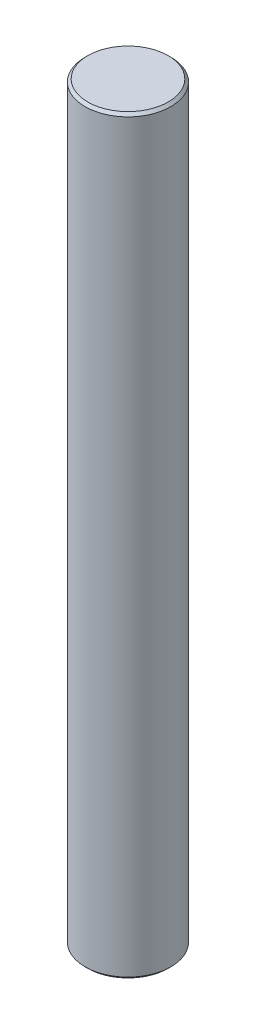
ISO-10303-21;
HEADER;
FILE_DESCRIPTION(('STEP AP214'),'2;1');
FILE_NAME('part.step','',(''),(''),'','','');
FILE_SCHEMA(('AUTOMOTIVE_DESIGN { 1 0 10303 214 1 1 1 1 }'));
ENDSEC;
DATA;
#1=APPLICATION_CONTEXT('core data for automotive mechanical design processes');
#2=APPLICATION_PROTOCOL_DEFINITION('international standard','automotive_design',2000,#1);
#3=PRODUCT_CONTEXT('',#1,'mechanical');
#4=PRODUCT('Part','Part','',(#3));
#5=PRODUCT_RELATED_PRODUCT_CATEGORY('part','',(#4));
#6=PRODUCT_DEFINITION_FORMATION('','',#4);
#7=PRODUCT_DEFINITION_CONTEXT('part definition',#1,'design');
#8=PRODUCT_DEFINITION('design','',#6,#7);
#9=PRODUCT_DEFINITION_SHAPE('','',#8);
#10=(LENGTH_UNIT() NAMED_UNIT(*) SI_UNIT(.MILLI.,.METRE.));
#11=(NAMED_UNIT(*) PLANE_ANGLE_UNIT() SI_UNIT($,.RADIAN.));
#12=(NAMED_UNIT(*) SI_UNIT($,.STERADIAN.) SOLID_ANGLE_UNIT());
#13=UNCERTAINTY_MEASURE_WITH_UNIT(LENGTH_MEASURE(1.E-05),#10,'distance_accuracy_value','');
#14=(GEOMETRIC_REPRESENTATION_CONTEXT(3) GLOBAL_UNCERTAINTY_ASSIGNED_CONTEXT((#13)) GLOBAL_UNIT_ASSIGNED_CONTEXT((#10,
#11,#12)) REPRESENTATION_CONTEXT('',''));
#15=CARTESIAN_POINT('',(0.,0.,0.));
#16=DIRECTION('',(0.,0.,1.));
#17=DIRECTION('',(1.,0.,0.));
#18=AXIS2_PLACEMENT_3D('',#15,#16,#17);
#19=CARTESIAN_POINT('',(0.,70.,0.));
#20=DIRECTION('',(0.,-1.,0.));
#21=DIRECTION('',(0.,0.,-1.));
#22=AXIS2_PLACEMENT_3D('',#19,#20,#21);
#23=CYLINDRICAL_SURFACE('',#22,4.);
#24=CARTESIAN_POINT('',(0.,0.250000000000014,0.));
#25=DIRECTION('',(0.,1.,0.));
#26=DIRECTION('',(0.,0.,1.));
#27=AXIS2_PLACEMENT_3D('',#24,#25,#26);
#28=CIRCLE('',#27,4.);
#29=CARTESIAN_POINT('',(0.,0.250000000000014,4.));
#30=VERTEX_POINT('',#29);
#31=EDGE_CURVE('E49',#30,#30,#28,.T.);
#32=ORIENTED_EDGE('',*,*,#31,.T.);
#33=EDGE_LOOP('',(#32));
#34=FACE_BOUND('',#33,.T.);
#35=CARTESIAN_POINT('',(0.,69.75,0.));
#36=DIRECTION('',(0.,1.,0.));
#37=DIRECTION('',(0.,0.,1.));
#38=AXIS2_PLACEMENT_3D('',#35,#36,#37);
#39=CIRCLE('',#38,4.);
#40=CARTESIAN_POINT('',(0.,69.75,4.));
#41=VERTEX_POINT('',#40);
#42=EDGE_CURVE('E53',#41,#41,#39,.F.);
#43=ORIENTED_EDGE('',*,*,#42,.T.);
#44=EDGE_LOOP('',(#43));
#45=FACE_BOUND('',#44,.T.);
#46=ADVANCED_FACE('F37',(#34,#45),#23,.T.);
#47=CARTESIAN_POINT('',(0.,70.,0.));
#48=DIRECTION('',(0.,1.,0.));
#49=DIRECTION('',(0.,0.,1.));
#50=AXIS2_PLACEMENT_3D('',#47,#48,#49);
#51=PLANE('',#50);
#52=CARTESIAN_POINT('',(0.,70.,0.));
#53=DIRECTION('',(0.,1.,0.));
#54=DIRECTION('',(0.,0.,1.));
#55=AXIS2_PLACEMENT_3D('',#52,#53,#54);
#56=CIRCLE('',#55,3.75);
#57=CARTESIAN_POINT('',(0.,70.,3.75));
#58=VERTEX_POINT('',#57);
#59=EDGE_CURVE('E10',#58,#58,#56,.T.);
#60=ORIENTED_EDGE('',*,*,#59,.T.);
#61=EDGE_LOOP('',(#60));
#62=FACE_BOUND('',#61,.T.);
#63=ADVANCED_FACE('F69',(#62),#51,.T.);
#64=CARTESIAN_POINT('',(0.,0.,0.));
#65=DIRECTION('',(0.,1.,0.));
#66=DIRECTION('',(0.,0.,1.));
#67=AXIS2_PLACEMENT_3D('',#64,#65,#66);
#68=PLANE('',#67);
#69=CARTESIAN_POINT('',(0.,0.,0.));
#70=DIRECTION('',(0.,1.,0.));
#71=DIRECTION('',(0.,0.,1.));
#72=AXIS2_PLACEMENT_3D('',#69,#70,#71);
#73=CIRCLE('',#72,3.74999999999998);
#74=CARTESIAN_POINT('',(0.,0.,3.74999999999998));
#75=VERTEX_POINT('',#74);
#76=EDGE_CURVE('E45',#75,#75,#73,.F.);
#77=ORIENTED_EDGE('',*,*,#76,.T.);
#78=EDGE_LOOP('',(#77));
#79=FACE_BOUND('',#78,.T.);
#80=ADVANCED_FACE('F66',(#79),#68,.F.);
#81=CARTESIAN_POINT('',(0.,0.250000000000014,0.));
#82=DIRECTION('',(0.,1.,0.));
#83=DIRECTION('',(0.,0.,1.));
#84=AXIS2_PLACEMENT_3D('',#81,#82,#83);
#85=CONICAL_SURFACE('',#84,4.,0.785398163397455);
#86=ORIENTED_EDGE('',*,*,#76,.F.);
#87=EDGE_LOOP('',(#86));
#88=FACE_BOUND('',#87,.T.);
#89=ORIENTED_EDGE('',*,*,#31,.F.);
#90=EDGE_LOOP('',(#89));
#91=FACE_BOUND('',#90,.T.);
#92=ADVANCED_FACE('F62',(#88,#91),#85,.T.);
#93=CARTESIAN_POINT('',(0.,70.,0.));
#94=DIRECTION('',(0.,-1.,0.));
#95=DIRECTION('',(0.,0.,-1.));
#96=AXIS2_PLACEMENT_3D('',#93,#94,#95);
#97=CONICAL_SURFACE('',#96,3.75,0.785398163397428);
#98=ORIENTED_EDGE('',*,*,#42,.F.);
#99=EDGE_LOOP('',(#98));
#100=FACE_BOUND('',#99,.T.);
#101=ORIENTED_EDGE('',*,*,#59,.F.);
#102=EDGE_LOOP('',(#101));
#103=FACE_BOUND('',#102,.T.);
#104=ADVANCED_FACE('F40',(#100,#103),#97,.T.);
#105=CLOSED_SHELL('',(#46,#63,#80,#92,#104));
#106=MANIFOLD_SOLID_BREP('B2',#105);
#107=ADVANCED_BREP_SHAPE_REPRESENTATION('',(#18,#106),#14);
#108=SHAPE_DEFINITION_REPRESENTATION(#9,#107);
ENDSEC;
END-ISO-10303-21;
